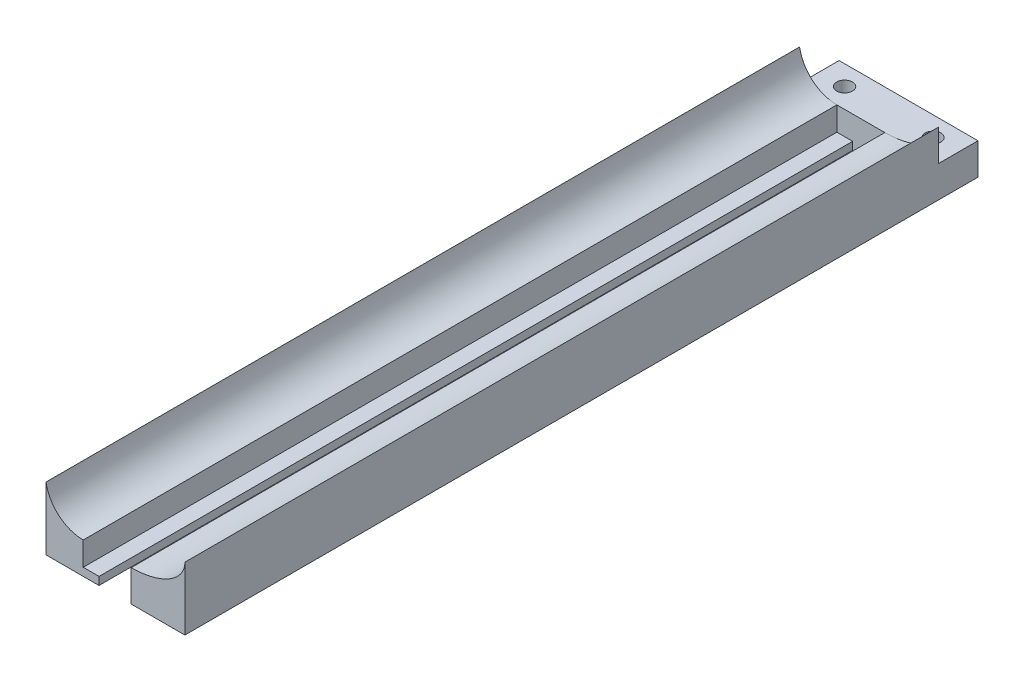
ISO-10303-21;
HEADER;
FILE_DESCRIPTION(('STEP AP214'),'2;1');
FILE_NAME('part.step','',(''),(''),'','','');
FILE_SCHEMA(('AUTOMOTIVE_DESIGN { 1 0 10303 214 1 1 1 1 }'));
ENDSEC;
DATA;
#1=APPLICATION_CONTEXT('core data for automotive mechanical design processes');
#2=APPLICATION_PROTOCOL_DEFINITION('international standard','automotive_design',2000,#1);
#3=PRODUCT_CONTEXT('',#1,'mechanical');
#4=PRODUCT('Part','Part','',(#3));
#5=PRODUCT_RELATED_PRODUCT_CATEGORY('part','',(#4));
#6=PRODUCT_DEFINITION_FORMATION('','',#4);
#7=PRODUCT_DEFINITION_CONTEXT('part definition',#1,'design');
#8=PRODUCT_DEFINITION('design','',#6,#7);
#9=PRODUCT_DEFINITION_SHAPE('','',#8);
#10=(LENGTH_UNIT() NAMED_UNIT(*) SI_UNIT(.MILLI.,.METRE.));
#11=(NAMED_UNIT(*) PLANE_ANGLE_UNIT() SI_UNIT($,.RADIAN.));
#12=(NAMED_UNIT(*) SI_UNIT($,.STERADIAN.) SOLID_ANGLE_UNIT());
#13=UNCERTAINTY_MEASURE_WITH_UNIT(LENGTH_MEASURE(1.E-05),#10,'distance_accuracy_value','');
#14=(GEOMETRIC_REPRESENTATION_CONTEXT(3) GLOBAL_UNCERTAINTY_ASSIGNED_CONTEXT((#13)) GLOBAL_UNIT_ASSIGNED_CONTEXT((#10,
#11,#12)) REPRESENTATION_CONTEXT('',''));
#15=CARTESIAN_POINT('',(0.,0.,0.));
#16=DIRECTION('',(0.,0.,1.));
#17=DIRECTION('',(1.,0.,0.));
#18=AXIS2_PLACEMENT_3D('',#15,#16,#17);
#19=CARTESIAN_POINT('',(0.,0.,7.9502));
#20=DIRECTION('',(0.,0.,-1.));
#21=DIRECTION('',(-1.,0.,0.));
#22=AXIS2_PLACEMENT_3D('',#19,#20,#21);
#23=PLANE('',#22);
#24=DIRECTION('',(0.,-1.,0.));
#25=VECTOR('',#24,1.);
#26=CARTESIAN_POINT('',(3.175,-3.175,7.9502));
#27=LINE('',#26,#25);
#28=CARTESIAN_POINT('',(3.175,3.175,7.9502));
#29=VERTEX_POINT('',#28);
#30=CARTESIAN_POINT('',(3.175,-3.175,7.9502));
#31=VERTEX_POINT('',#30);
#32=EDGE_CURVE('E212',#29,#31,#27,.T.);
#33=ORIENTED_EDGE('',*,*,#32,.F.);
#34=DIRECTION('',(-1.,0.,0.));
#35=VECTOR('',#34,1.);
#36=CARTESIAN_POINT('',(-13.97,3.175,7.9502));
#37=LINE('',#36,#35);
#38=CARTESIAN_POINT('',(-6.477,3.175,7.9502));
#39=VERTEX_POINT('',#38);
#40=EDGE_CURVE('E139',#29,#39,#37,.T.);
#41=ORIENTED_EDGE('',*,*,#40,.T.);
#42=DIRECTION('',(0.,1.,0.));
#43=VECTOR('',#42,1.);
#44=CARTESIAN_POINT('',(-6.477,-1.5875,7.9502));
#45=LINE('',#44,#43);
#46=CARTESIAN_POINT('',(-6.477,-1.5875,7.9502));
#47=VERTEX_POINT('',#46);
#48=EDGE_CURVE('E55',#47,#39,#45,.T.);
#49=ORIENTED_EDGE('',*,*,#48,.F.);
#50=DIRECTION('',(-1.,0.,0.));
#51=VECTOR('',#50,1.);
#52=CARTESIAN_POINT('',(-3.302,-1.5875,7.9502));
#53=LINE('',#52,#51);
#54=CARTESIAN_POINT('',(-3.302,-1.5875,7.9502));
#55=VERTEX_POINT('',#54);
#56=EDGE_CURVE('E205',#55,#47,#53,.T.);
#57=ORIENTED_EDGE('',*,*,#56,.F.);
#58=DIRECTION('',(0.,1.,0.));
#59=VECTOR('',#58,1.);
#60=CARTESIAN_POINT('',(-3.302,-3.175,7.9502));
#61=LINE('',#60,#59);
#62=CARTESIAN_POINT('',(-3.302,-3.175,7.9502));
#63=VERTEX_POINT('',#62);
#64=EDGE_CURVE('E202',#63,#55,#61,.T.);
#65=ORIENTED_EDGE('',*,*,#64,.F.);
#66=DIRECTION('',(1.,0.,0.));
#67=VECTOR('',#66,1.);
#68=CARTESIAN_POINT('',(-13.97,-3.175,7.9502));
#69=LINE('',#68,#67);
#70=EDGE_CURVE('E48',#63,#31,#69,.T.);
#71=ORIENTED_EDGE('',*,*,#70,.T.);
#72=EDGE_LOOP('',(#33,#41,#49,#57,#65,#71));
#73=FACE_BOUND('',#72,.T.);
#74=ADVANCED_FACE('F33',(#73),#23,.F.);
#75=CARTESIAN_POINT('',(13.97,-3.175,7.9502));
#76=DIRECTION('',(-1.,0.,0.));
#77=DIRECTION('',(0.,0.,1.));
#78=AXIS2_PLACEMENT_3D('',#75,#76,#77);
#79=PLANE('',#78);
#80=DIRECTION('',(0.,1.,0.));
#81=VECTOR('',#80,1.);
#82=CARTESIAN_POINT('',(13.97,-3.175,0.));
#83=LINE('',#82,#81);
#84=CARTESIAN_POINT('',(13.97,-3.175,0.));
#85=VERTEX_POINT('',#84);
#86=CARTESIAN_POINT('',(13.97,3.175,0.));
#87=VERTEX_POINT('',#86);
#88=EDGE_CURVE('E146',#85,#87,#83,.T.);
#89=ORIENTED_EDGE('',*,*,#88,.T.);
#90=DIRECTION('',(0.,0.,-1.));
#91=VECTOR('',#90,1.);
#92=CARTESIAN_POINT('',(13.97,3.175,7.9502));
#93=LINE('',#92,#91);
#94=CARTESIAN_POINT('',(13.97,3.175,7.9502));
#95=VERTEX_POINT('',#94);
#96=EDGE_CURVE('E11',#95,#87,#93,.T.);
#97=ORIENTED_EDGE('',*,*,#96,.F.);
#98=DIRECTION('',(0.,1.,0.));
#99=VECTOR('',#98,1.);
#100=CARTESIAN_POINT('',(13.97,3.175,7.9502));
#101=LINE('',#100,#99);
#102=CARTESIAN_POINT('',(13.97,9.525,7.9502));
#103=VERTEX_POINT('',#102);
#104=EDGE_CURVE('E121',#95,#103,#101,.T.);
#105=ORIENTED_EDGE('',*,*,#104,.T.);
#106=DIRECTION('',(0.,0.,1.));
#107=VECTOR('',#106,1.);
#108=CARTESIAN_POINT('',(13.97,9.525,-4.57395765630567));
#109=LINE('',#108,#107);
#110=CARTESIAN_POINT('',(13.97,9.525,159.55645));
#111=VERTEX_POINT('',#110);
#112=EDGE_CURVE('E131',#103,#111,#109,.T.);
#113=ORIENTED_EDGE('',*,*,#112,.T.);
#114=DIRECTION('',(0.,1.,0.));
#115=VECTOR('',#114,1.);
#116=CARTESIAN_POINT('',(13.97,-3.175,159.55645));
#117=LINE('',#116,#115);
#118=CARTESIAN_POINT('',(13.97,-3.175,159.55645));
#119=VERTEX_POINT('',#118);
#120=EDGE_CURVE('E238',#119,#111,#117,.T.);
#121=ORIENTED_EDGE('',*,*,#120,.F.);
#122=DIRECTION('',(0.,0.,-1.));
#123=VECTOR('',#122,1.);
#124=CARTESIAN_POINT('',(13.97,-3.175,7.9502));
#125=LINE('',#124,#123);
#126=EDGE_CURVE('E148',#119,#85,#125,.T.);
#127=ORIENTED_EDGE('',*,*,#126,.T.);
#128=EDGE_LOOP('',(#89,#97,#105,#113,#121,#127));
#129=FACE_BOUND('',#128,.T.);
#130=ADVANCED_FACE('F35',(#129),#79,.F.);
#131=CARTESIAN_POINT('',(-13.97,3.175,7.9502));
#132=DIRECTION('',(0.,-1.,0.));
#133=DIRECTION('',(0.,0.,-1.));
#134=AXIS2_PLACEMENT_3D('',#131,#132,#133);
#135=PLANE('',#134);
#136=CARTESIAN_POINT('',(-8.89,3.175,3.9751));
#137=DIRECTION('',(0.,1.,0.));
#138=DIRECTION('',(0.,0.,1.));
#139=AXIS2_PLACEMENT_3D('',#136,#137,#138);
#140=CIRCLE('',#139,1.5875);
#141=CARTESIAN_POINT('',(-8.89,3.175,5.5626));
#142=VERTEX_POINT('',#141);
#143=EDGE_CURVE('E250',#142,#142,#140,.T.);
#144=ORIENTED_EDGE('',*,*,#143,.F.);
#145=EDGE_LOOP('',(#144));
#146=FACE_BOUND('',#145,.T.);
#147=CARTESIAN_POINT('',(8.89,3.175,3.9751));
#148=DIRECTION('',(0.,1.,0.));
#149=DIRECTION('',(0.,0.,1.));
#150=AXIS2_PLACEMENT_3D('',#147,#148,#149);
#151=CIRCLE('',#150,1.5875);
#152=CARTESIAN_POINT('',(8.89,3.175,5.5626));
#153=VERTEX_POINT('',#152);
#154=EDGE_CURVE('E243',#153,#153,#151,.T.);
#155=ORIENTED_EDGE('',*,*,#154,.F.);
#156=EDGE_LOOP('',(#155));
#157=FACE_BOUND('',#156,.T.);
#158=ORIENTED_EDGE('',*,*,#40,.F.);
#159=DIRECTION('',(1.,0.,0.));
#160=VECTOR('',#159,1.);
#161=CARTESIAN_POINT('',(3.175,3.175,7.9502));
#162=LINE('',#161,#160);
#163=EDGE_CURVE('E124',#29,#95,#162,.T.);
#164=ORIENTED_EDGE('',*,*,#163,.T.);
#165=ORIENTED_EDGE('',*,*,#96,.T.);
#166=DIRECTION('',(-1.,0.,0.));
#167=VECTOR('',#166,1.);
#168=CARTESIAN_POINT('',(-13.97,3.175,0.));
#169=LINE('',#168,#167);
#170=CARTESIAN_POINT('',(-13.97,3.175,0.));
#171=VERTEX_POINT('',#170);
#172=EDGE_CURVE('E151',#87,#171,#169,.T.);
#173=ORIENTED_EDGE('',*,*,#172,.T.);
#174=DIRECTION('',(0.,0.,-1.));
#175=VECTOR('',#174,1.);
#176=CARTESIAN_POINT('',(-13.97,3.175,7.9502));
#177=LINE('',#176,#175);
#178=CARTESIAN_POINT('',(-13.97,3.175,7.9502));
#179=VERTEX_POINT('',#178);
#180=EDGE_CURVE('E41',#179,#171,#177,.T.);
#181=ORIENTED_EDGE('',*,*,#180,.F.);
#182=DIRECTION('',(1.,0.,0.));
#183=VECTOR('',#182,1.);
#184=CARTESIAN_POINT('',(-13.97,3.175,7.9502));
#185=LINE('',#184,#183);
#186=EDGE_CURVE('E247',#179,#39,#185,.T.);
#187=ORIENTED_EDGE('',*,*,#186,.T.);
#188=EDGE_LOOP('',(#158,#164,#165,#173,#181,#187));
#189=FACE_BOUND('',#188,.T.);
#190=ADVANCED_FACE('F135',(#146,#157,#189),#135,.F.);
#191=CARTESIAN_POINT('',(-13.97,-3.175,7.9502));
#192=DIRECTION('',(1.,0.,0.));
#193=DIRECTION('',(0.,0.,-1.));
#194=AXIS2_PLACEMENT_3D('',#191,#192,#193);
#195=PLANE('',#194);
#196=DIRECTION('',(0.,-1.,0.));
#197=VECTOR('',#196,1.);
#198=CARTESIAN_POINT('',(-13.97,-3.175,0.));
#199=LINE('',#198,#197);
#200=CARTESIAN_POINT('',(-13.97,-3.175,0.));
#201=VERTEX_POINT('',#200);
#202=EDGE_CURVE('E154',#171,#201,#199,.T.);
#203=ORIENTED_EDGE('',*,*,#202,.T.);
#204=DIRECTION('',(0.,0.,-1.));
#205=VECTOR('',#204,1.);
#206=CARTESIAN_POINT('',(-13.97,-3.175,7.9502));
#207=LINE('',#206,#205);
#208=CARTESIAN_POINT('',(-13.97,-3.175,159.55645));
#209=VERTEX_POINT('',#208);
#210=EDGE_CURVE('E166',#209,#201,#207,.T.);
#211=ORIENTED_EDGE('',*,*,#210,.F.);
#212=DIRECTION('',(0.,-1.,0.));
#213=VECTOR('',#212,1.);
#214=CARTESIAN_POINT('',(-13.97,3.175,159.55645));
#215=LINE('',#214,#213);
#216=CARTESIAN_POINT('',(-13.97,9.525,159.55645));
#217=VERTEX_POINT('',#216);
#218=EDGE_CURVE('E185',#217,#209,#215,.T.);
#219=ORIENTED_EDGE('',*,*,#218,.F.);
#220=DIRECTION('',(0.,0.,1.));
#221=VECTOR('',#220,1.);
#222=CARTESIAN_POINT('',(-13.97,9.525,-4.57395765630567));
#223=LINE('',#222,#221);
#224=CARTESIAN_POINT('',(-13.97,9.525,7.9502));
#225=VERTEX_POINT('',#224);
#226=EDGE_CURVE('E255',#225,#217,#223,.T.);
#227=ORIENTED_EDGE('',*,*,#226,.F.);
#228=DIRECTION('',(0.,-1.,0.));
#229=VECTOR('',#228,1.);
#230=CARTESIAN_POINT('',(-13.97,3.175,7.9502));
#231=LINE('',#230,#229);
#232=EDGE_CURVE('E174',#225,#179,#231,.T.);
#233=ORIENTED_EDGE('',*,*,#232,.T.);
#234=ORIENTED_EDGE('',*,*,#180,.T.);
#235=EDGE_LOOP('',(#203,#211,#219,#227,#233,#234));
#236=FACE_BOUND('',#235,.T.);
#237=ADVANCED_FACE('F171',(#236),#195,.F.);
#238=CARTESIAN_POINT('',(-13.97,-3.175,7.9502));
#239=DIRECTION('',(0.,1.,0.));
#240=DIRECTION('',(0.,0.,1.));
#241=AXIS2_PLACEMENT_3D('',#238,#239,#240);
#242=PLANE('',#241);
#243=CARTESIAN_POINT('',(-8.89,-3.175,3.9751));
#244=DIRECTION('',(0.,1.,0.));
#245=DIRECTION('',(0.,0.,1.));
#246=AXIS2_PLACEMENT_3D('',#243,#244,#245);
#247=CIRCLE('',#246,1.5875);
#248=CARTESIAN_POINT('',(-8.89,-3.175,5.5626));
#249=VERTEX_POINT('',#248);
#250=EDGE_CURVE('E239',#249,#249,#247,.T.);
#251=ORIENTED_EDGE('',*,*,#250,.T.);
#252=EDGE_LOOP('',(#251));
#253=FACE_BOUND('',#252,.T.);
#254=CARTESIAN_POINT('',(8.89,-3.175,3.9751));
#255=DIRECTION('',(0.,1.,0.));
#256=DIRECTION('',(0.,0.,1.));
#257=AXIS2_PLACEMENT_3D('',#254,#255,#256);
#258=CIRCLE('',#257,1.5875);
#259=CARTESIAN_POINT('',(8.89,-3.175,5.5626));
#260=VERTEX_POINT('',#259);
#261=EDGE_CURVE('E246',#260,#260,#258,.T.);
#262=ORIENTED_EDGE('',*,*,#261,.T.);
#263=EDGE_LOOP('',(#262));
#264=FACE_BOUND('',#263,.T.);
#265=DIRECTION('',(1.,0.,0.));
#266=VECTOR('',#265,1.);
#267=CARTESIAN_POINT('',(-13.97,-3.175,0.));
#268=LINE('',#267,#266);
#269=EDGE_CURVE('E163',#201,#85,#268,.T.);
#270=ORIENTED_EDGE('',*,*,#269,.T.);
#271=ORIENTED_EDGE('',*,*,#126,.F.);
#272=DIRECTION('',(1.,0.,0.));
#273=VECTOR('',#272,1.);
#274=CARTESIAN_POINT('',(13.97,-3.175,159.55645));
#275=LINE('',#274,#273);
#276=CARTESIAN_POINT('',(3.175,-3.175,159.55645));
#277=VERTEX_POINT('',#276);
#278=EDGE_CURVE('E228',#277,#119,#275,.T.);
#279=ORIENTED_EDGE('',*,*,#278,.F.);
#280=DIRECTION('',(0.,0.,-1.));
#281=VECTOR('',#280,1.);
#282=CARTESIAN_POINT('',(3.175,-3.175,159.55645));
#283=LINE('',#282,#281);
#284=EDGE_CURVE('E227',#277,#31,#283,.T.);
#285=ORIENTED_EDGE('',*,*,#284,.T.);
#286=ORIENTED_EDGE('',*,*,#70,.F.);
#287=DIRECTION('',(0.,0.,-1.));
#288=VECTOR('',#287,1.);
#289=CARTESIAN_POINT('',(-3.302,-3.175,159.55645));
#290=LINE('',#289,#288);
#291=CARTESIAN_POINT('',(-3.302,-3.175,159.55645));
#292=VERTEX_POINT('',#291);
#293=EDGE_CURVE('E152',#292,#63,#290,.T.);
#294=ORIENTED_EDGE('',*,*,#293,.F.);
#295=DIRECTION('',(1.,0.,0.));
#296=VECTOR('',#295,1.);
#297=CARTESIAN_POINT('',(-13.97,-3.175,159.55645));
#298=LINE('',#297,#296);
#299=EDGE_CURVE('E183',#209,#292,#298,.T.);
#300=ORIENTED_EDGE('',*,*,#299,.F.);
#301=ORIENTED_EDGE('',*,*,#210,.T.);
#302=EDGE_LOOP('',(#270,#271,#279,#285,#286,#294,#300,#301));
#303=FACE_BOUND('',#302,.T.);
#304=ADVANCED_FACE('F177',(#253,#264,#303),#242,.F.);
#305=CARTESIAN_POINT('',(0.,0.,0.));
#306=DIRECTION('',(0.,0.,-1.));
#307=DIRECTION('',(-1.,0.,0.));
#308=AXIS2_PLACEMENT_3D('',#305,#306,#307);
#309=PLANE('',#308);
#310=ORIENTED_EDGE('',*,*,#88,.F.);
#311=ORIENTED_EDGE('',*,*,#269,.F.);
#312=ORIENTED_EDGE('',*,*,#202,.F.);
#313=ORIENTED_EDGE('',*,*,#172,.F.);
#314=EDGE_LOOP('',(#310,#311,#312,#313));
#315=FACE_BOUND('',#314,.T.);
#316=ADVANCED_FACE('F175',(#315),#309,.T.);
#317=CARTESIAN_POINT('',(-3.302,-3.175,159.55645));
#318=DIRECTION('',(-1.,0.,0.));
#319=DIRECTION('',(0.,0.,1.));
#320=AXIS2_PLACEMENT_3D('',#317,#318,#319);
#321=PLANE('',#320);
#322=ORIENTED_EDGE('',*,*,#64,.T.);
#323=DIRECTION('',(0.,0.,-1.));
#324=VECTOR('',#323,1.);
#325=CARTESIAN_POINT('',(-3.302,-1.5875,159.55645));
#326=LINE('',#325,#324);
#327=CARTESIAN_POINT('',(-3.302,-1.5875,159.55645));
#328=VERTEX_POINT('',#327);
#329=EDGE_CURVE('E157',#328,#55,#326,.T.);
#330=ORIENTED_EDGE('',*,*,#329,.F.);
#331=DIRECTION('',(0.,1.,0.));
#332=VECTOR('',#331,1.);
#333=CARTESIAN_POINT('',(-3.302,-3.175,159.55645));
#334=LINE('',#333,#332);
#335=EDGE_CURVE('E224',#292,#328,#334,.T.);
#336=ORIENTED_EDGE('',*,*,#335,.F.);
#337=ORIENTED_EDGE('',*,*,#293,.T.);
#338=EDGE_LOOP('',(#322,#330,#336,#337));
#339=FACE_BOUND('',#338,.T.);
#340=ADVANCED_FACE('F223',(#339),#321,.F.);
#341=CARTESIAN_POINT('',(-3.302,-1.5875,159.55645));
#342=DIRECTION('',(0.,-1.,0.));
#343=DIRECTION('',(1.,0.,0.));
#344=AXIS2_PLACEMENT_3D('',#341,#342,#343);
#345=PLANE('',#344);
#346=ORIENTED_EDGE('',*,*,#56,.T.);
#347=DIRECTION('',(0.,0.,-1.));
#348=VECTOR('',#347,1.);
#349=CARTESIAN_POINT('',(-6.477,-1.5875,159.55645));
#350=LINE('',#349,#348);
#351=CARTESIAN_POINT('',(-6.477,-1.5875,159.55645));
#352=VERTEX_POINT('',#351);
#353=EDGE_CURVE('E196',#352,#47,#350,.T.);
#354=ORIENTED_EDGE('',*,*,#353,.F.);
#355=DIRECTION('',(-1.,0.,0.));
#356=VECTOR('',#355,1.);
#357=CARTESIAN_POINT('',(-3.302,-1.5875,159.55645));
#358=LINE('',#357,#356);
#359=EDGE_CURVE('E198',#328,#352,#358,.T.);
#360=ORIENTED_EDGE('',*,*,#359,.F.);
#361=ORIENTED_EDGE('',*,*,#329,.T.);
#362=EDGE_LOOP('',(#346,#354,#360,#361));
#363=FACE_BOUND('',#362,.T.);
#364=ADVANCED_FACE('F220',(#363),#345,.F.);
#365=CARTESIAN_POINT('',(-6.477,-1.5875,159.55645));
#366=DIRECTION('',(-1.,0.,0.));
#367=DIRECTION('',(0.,-1.,0.));
#368=AXIS2_PLACEMENT_3D('',#365,#366,#367);
#369=PLANE('',#368);
#370=ORIENTED_EDGE('',*,*,#48,.T.);
#371=DIRECTION('',(0.,0.,-1.));
#372=VECTOR('',#371,1.);
#373=CARTESIAN_POINT('',(-6.477,3.175,159.55645));
#374=LINE('',#373,#372);
#375=CARTESIAN_POINT('',(-6.477,3.175,159.55645));
#376=VERTEX_POINT('',#375);
#377=EDGE_CURVE('E192',#376,#39,#374,.T.);
#378=ORIENTED_EDGE('',*,*,#377,.F.);
#379=DIRECTION('',(0.,1.,0.));
#380=VECTOR('',#379,1.);
#381=CARTESIAN_POINT('',(-6.477,-1.5875,159.55645));
#382=LINE('',#381,#380);
#383=EDGE_CURVE('E193',#352,#376,#382,.T.);
#384=ORIENTED_EDGE('',*,*,#383,.F.);
#385=ORIENTED_EDGE('',*,*,#353,.T.);
#386=EDGE_LOOP('',(#370,#378,#384,#385));
#387=FACE_BOUND('',#386,.T.);
#388=ADVANCED_FACE('F215',(#387),#369,.F.);
#389=CARTESIAN_POINT('',(0.,0.,159.55645));
#390=DIRECTION('',(0.,0.,1.));
#391=DIRECTION('',(1.,0.,0.));
#392=AXIS2_PLACEMENT_3D('',#389,#390,#391);
#393=PLANE('',#392);
#394=ORIENTED_EDGE('',*,*,#299,.T.);
#395=ORIENTED_EDGE('',*,*,#335,.T.);
#396=ORIENTED_EDGE('',*,*,#359,.T.);
#397=ORIENTED_EDGE('',*,*,#383,.T.);
#398=CARTESIAN_POINT('',(-6.477,10.77087,159.55645));
#399=DIRECTION('',(0.,0.,-1.));
#400=DIRECTION('',(-1.,0.,0.));
#401=AXIS2_PLACEMENT_3D('',#398,#399,#400);
#402=CIRCLE('',#401,7.59587);
#403=EDGE_CURVE('E191',#376,#217,#402,.T.);
#404=ORIENTED_EDGE('',*,*,#403,.T.);
#405=ORIENTED_EDGE('',*,*,#218,.T.);
#406=EDGE_LOOP('',(#394,#395,#396,#397,#404,#405));
#407=FACE_BOUND('',#406,.T.);
#408=ADVANCED_FACE('F189',(#407),#393,.T.);
#409=CARTESIAN_POINT('',(3.175,-3.175,159.55645));
#410=DIRECTION('',(1.,0.,0.));
#411=DIRECTION('',(0.,0.,-1.));
#412=AXIS2_PLACEMENT_3D('',#409,#410,#411);
#413=PLANE('',#412);
#414=ORIENTED_EDGE('',*,*,#32,.T.);
#415=ORIENTED_EDGE('',*,*,#284,.F.);
#416=DIRECTION('',(0.,-1.,0.));
#417=VECTOR('',#416,1.);
#418=CARTESIAN_POINT('',(3.175,-3.175,159.55645));
#419=LINE('',#418,#417);
#420=CARTESIAN_POINT('',(3.175,3.175,159.55645));
#421=VERTEX_POINT('',#420);
#422=EDGE_CURVE('E233',#421,#277,#419,.T.);
#423=ORIENTED_EDGE('',*,*,#422,.F.);
#424=DIRECTION('',(0.,0.,-1.));
#425=VECTOR('',#424,1.);
#426=CARTESIAN_POINT('',(3.175,3.175,159.55645));
#427=LINE('',#426,#425);
#428=EDGE_CURVE('E206',#421,#29,#427,.T.);
#429=ORIENTED_EDGE('',*,*,#428,.T.);
#430=EDGE_LOOP('',(#414,#415,#423,#429));
#431=FACE_BOUND('',#430,.T.);
#432=ADVANCED_FACE('F291',(#431),#413,.F.);
#433=CARTESIAN_POINT('',(0.,0.,159.55645));
#434=DIRECTION('',(0.,0.,1.));
#435=DIRECTION('',(1.,0.,0.));
#436=AXIS2_PLACEMENT_3D('',#433,#434,#435);
#437=PLANE('',#436);
#438=ORIENTED_EDGE('',*,*,#120,.T.);
#439=CARTESIAN_POINT('',(3.175,9.525,159.55645));
#440=DIRECTION('',(0.,0.,-1.));
#441=DIRECTION('',(1.,0.,0.));
#442=AXIS2_PLACEMENT_3D('',#439,#440,#441);
#443=ELLIPSE('',#442,10.795,6.34999999999999);
#444=EDGE_CURVE('E141',#111,#421,#443,.T.);
#445=ORIENTED_EDGE('',*,*,#444,.T.);
#446=ORIENTED_EDGE('',*,*,#422,.T.);
#447=ORIENTED_EDGE('',*,*,#278,.T.);
#448=EDGE_LOOP('',(#438,#445,#446,#447));
#449=FACE_BOUND('',#448,.T.);
#450=ADVANCED_FACE('F287',(#449),#437,.T.);
#451=CARTESIAN_POINT('',(8.89,-3.175,3.9751));
#452=DIRECTION('',(0.,1.,0.));
#453=DIRECTION('',(0.,0.,1.));
#454=AXIS2_PLACEMENT_3D('',#451,#452,#453);
#455=CYLINDRICAL_SURFACE('',#454,1.5875);
#456=ORIENTED_EDGE('',*,*,#261,.F.);
#457=EDGE_LOOP('',(#456));
#458=FACE_BOUND('',#457,.T.);
#459=ORIENTED_EDGE('',*,*,#154,.T.);
#460=EDGE_LOOP('',(#459));
#461=FACE_BOUND('',#460,.T.);
#462=ADVANCED_FACE('F283',(#458,#461),#455,.F.);
#463=CARTESIAN_POINT('',(-8.89,-3.175,3.9751));
#464=DIRECTION('',(0.,1.,0.));
#465=DIRECTION('',(0.,0.,1.));
#466=AXIS2_PLACEMENT_3D('',#463,#464,#465);
#467=CYLINDRICAL_SURFACE('',#466,1.5875);
#468=ORIENTED_EDGE('',*,*,#250,.F.);
#469=EDGE_LOOP('',(#468));
#470=FACE_BOUND('',#469,.T.);
#471=ORIENTED_EDGE('',*,*,#143,.T.);
#472=EDGE_LOOP('',(#471));
#473=FACE_BOUND('',#472,.T.);
#474=ADVANCED_FACE('F279',(#470,#473),#467,.F.);
#475=CARTESIAN_POINT('',(0.,0.,7.9502));
#476=DIRECTION('',(0.,0.,-1.));
#477=DIRECTION('',(-1.,0.,0.));
#478=AXIS2_PLACEMENT_3D('',#475,#476,#477);
#479=PLANE('',#478);
#480=ORIENTED_EDGE('',*,*,#186,.F.);
#481=ORIENTED_EDGE('',*,*,#232,.F.);
#482=CARTESIAN_POINT('',(-6.477,10.77087,7.9502));
#483=DIRECTION('',(0.,0.,-1.));
#484=DIRECTION('',(-1.,0.,0.));
#485=AXIS2_PLACEMENT_3D('',#482,#483,#484);
#486=CIRCLE('',#485,7.59587);
#487=EDGE_CURVE('E257',#39,#225,#486,.T.);
#488=ORIENTED_EDGE('',*,*,#487,.F.);
#489=EDGE_LOOP('',(#480,#481,#488));
#490=FACE_BOUND('',#489,.T.);
#491=ADVANCED_FACE('F275',(#490),#479,.T.);
#492=CARTESIAN_POINT('',(-6.477,10.77087,-4.57395765630567));
#493=DIRECTION('',(0.,0.,1.));
#494=DIRECTION('',(1.,0.,0.));
#495=AXIS2_PLACEMENT_3D('',#492,#493,#494);
#496=CYLINDRICAL_SURFACE('',#495,7.59587);
#497=ORIENTED_EDGE('',*,*,#377,.T.);
#498=ORIENTED_EDGE('',*,*,#487,.T.);
#499=ORIENTED_EDGE('',*,*,#226,.T.);
#500=ORIENTED_EDGE('',*,*,#403,.F.);
#501=EDGE_LOOP('',(#497,#498,#499,#500));
#502=FACE_BOUND('',#501,.T.);
#503=ADVANCED_FACE('F272',(#502),#496,.F.);
#504=CARTESIAN_POINT('',(0.,0.,7.9502));
#505=DIRECTION('',(0.,0.,-1.));
#506=DIRECTION('',(-1.,0.,0.));
#507=AXIS2_PLACEMENT_3D('',#504,#505,#506);
#508=PLANE('',#507);
#509=CARTESIAN_POINT('',(3.175,9.525,7.9502));
#510=DIRECTION('',(0.,0.,-1.));
#511=DIRECTION('',(1.,0.,0.));
#512=AXIS2_PLACEMENT_3D('',#509,#510,#511);
#513=ELLIPSE('',#512,10.795,6.34999999999999);
#514=EDGE_CURVE('E126',#103,#29,#513,.T.);
#515=ORIENTED_EDGE('',*,*,#514,.F.);
#516=ORIENTED_EDGE('',*,*,#104,.F.);
#517=ORIENTED_EDGE('',*,*,#163,.F.);
#518=EDGE_LOOP('',(#515,#516,#517));
#519=FACE_BOUND('',#518,.T.);
#520=ADVANCED_FACE('F123',(#519),#508,.T.);
#521=CARTESIAN_POINT('',(3.175,9.525,-4.57395765630567));
#522=DIRECTION('',(0.,0.,-1.));
#523=DIRECTION('',(1.,0.,0.));
#524=AXIS2_PLACEMENT_3D('',#521,#522,#523);
#525=ELLIPSE('',#524,10.795,6.34999999999999);
#526=DIRECTION('',(0.,0.,1.));
#527=VECTOR('',#526,1.);
#528=SURFACE_OF_LINEAR_EXTRUSION('',#525,#527);
#529=ORIENTED_EDGE('',*,*,#112,.F.);
#530=ORIENTED_EDGE('',*,*,#514,.T.);
#531=ORIENTED_EDGE('',*,*,#428,.F.);
#532=ORIENTED_EDGE('',*,*,#444,.F.);
#533=EDGE_LOOP('',(#529,#530,#531,#532));
#534=FACE_BOUND('',#533,.T.);
#535=ADVANCED_FACE('F266',(#534),#528,.T.);
#536=CLOSED_SHELL('',(#74,#130,#190,#237,#304,#316,#340,#364,#388,#408,#432,#450,#462,#474,#491,
#503,#520,#535));
#537=MANIFOLD_SOLID_BREP('B2',#536);
#538=ADVANCED_BREP_SHAPE_REPRESENTATION('',(#18,#537),#14);
#539=SHAPE_DEFINITION_REPRESENTATION(#9,#538);
ENDSEC;
END-ISO-10303-21;
